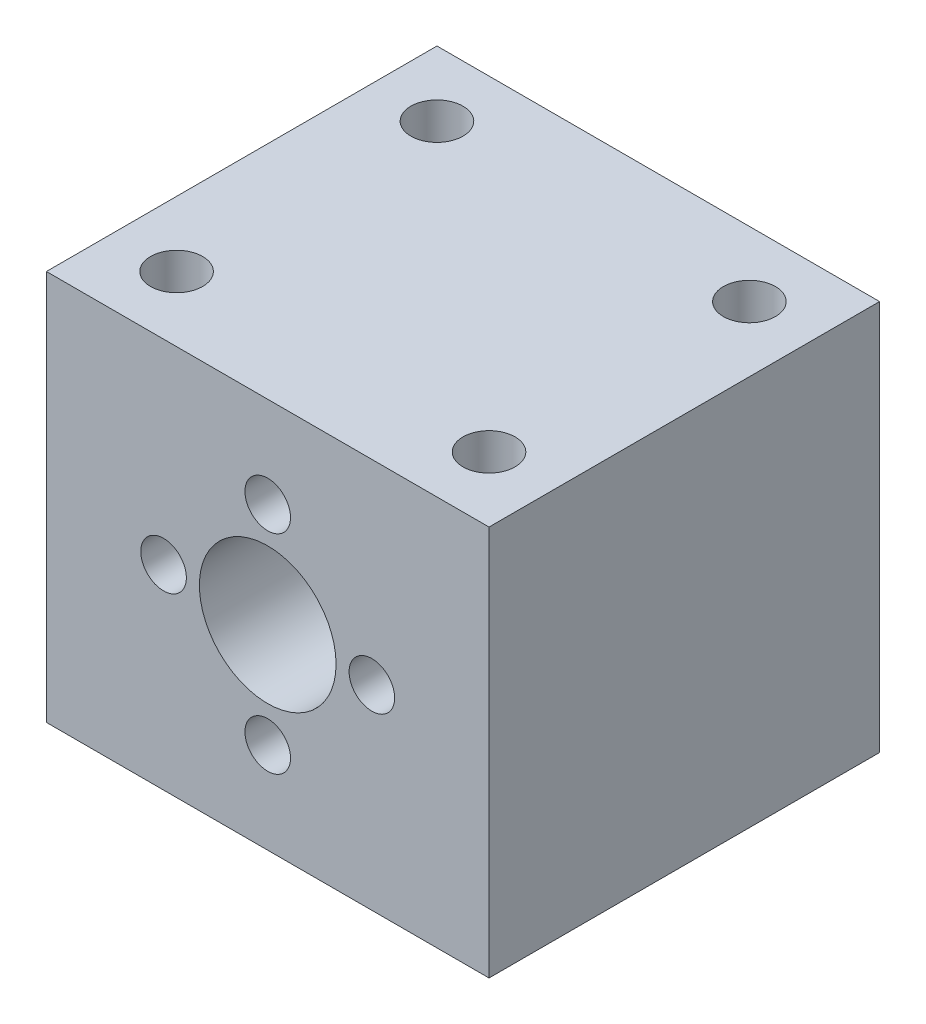
ISO-10303-21;
HEADER;
FILE_DESCRIPTION(('STEP AP214'),'2;1');
FILE_NAME('part.step','',(''),(''),'','','');
FILE_SCHEMA(('AUTOMOTIVE_DESIGN { 1 0 10303 214 1 1 1 1 }'));
ENDSEC;
DATA;
#1=APPLICATION_CONTEXT('core data for automotive mechanical design processes');
#2=APPLICATION_PROTOCOL_DEFINITION('international standard','automotive_design',2000,#1);
#3=PRODUCT_CONTEXT('',#1,'mechanical');
#4=PRODUCT('Part','Part','',(#3));
#5=PRODUCT_RELATED_PRODUCT_CATEGORY('part','',(#4));
#6=PRODUCT_DEFINITION_FORMATION('','',#4);
#7=PRODUCT_DEFINITION_CONTEXT('part definition',#1,'design');
#8=PRODUCT_DEFINITION('design','',#6,#7);
#9=PRODUCT_DEFINITION_SHAPE('','',#8);
#10=(LENGTH_UNIT() NAMED_UNIT(*) SI_UNIT(.MILLI.,.METRE.));
#11=(NAMED_UNIT(*) PLANE_ANGLE_UNIT() SI_UNIT($,.RADIAN.));
#12=(NAMED_UNIT(*) SI_UNIT($,.STERADIAN.) SOLID_ANGLE_UNIT());
#13=UNCERTAINTY_MEASURE_WITH_UNIT(LENGTH_MEASURE(1.E-05),#10,'distance_accuracy_value','');
#14=(GEOMETRIC_REPRESENTATION_CONTEXT(3) GLOBAL_UNCERTAINTY_ASSIGNED_CONTEXT((#13)) GLOBAL_UNIT_ASSIGNED_CONTEXT((#10,
#11,#12)) REPRESENTATION_CONTEXT('',''));
#15=CARTESIAN_POINT('',(0.,0.,0.));
#16=DIRECTION('',(0.,0.,1.));
#17=DIRECTION('',(1.,0.,0.));
#18=AXIS2_PLACEMENT_3D('',#15,#16,#17);
#19=CARTESIAN_POINT('',(0.,0.,30.));
#20=DIRECTION('',(0.,0.,-1.));
#21=DIRECTION('',(-1.,0.,0.));
#22=AXIS2_PLACEMENT_3D('',#19,#20,#21);
#23=PLANE('',#22);
#24=CARTESIAN_POINT('',(-8.,0.,30.));
#25=DIRECTION('',(0.,0.,1.));
#26=DIRECTION('',(1.,0.,0.));
#27=AXIS2_PLACEMENT_3D('',#24,#25,#26);
#28=CIRCLE('',#27,1.75);
#29=CARTESIAN_POINT('',(-6.25,0.,30.));
#30=VERTEX_POINT('',#29);
#31=EDGE_CURVE('E142',#30,#30,#28,.T.);
#32=ORIENTED_EDGE('',*,*,#31,.F.);
#33=EDGE_LOOP('',(#32));
#34=FACE_BOUND('',#33,.T.);
#35=CARTESIAN_POINT('',(0.,8.,30.));
#36=DIRECTION('',(0.,0.,1.));
#37=DIRECTION('',(1.,0.,0.));
#38=AXIS2_PLACEMENT_3D('',#35,#36,#37);
#39=CIRCLE('',#38,1.75);
#40=CARTESIAN_POINT('',(1.75000000000003,8.,30.));
#41=VERTEX_POINT('',#40);
#42=EDGE_CURVE('E136',#41,#41,#39,.T.);
#43=ORIENTED_EDGE('',*,*,#42,.F.);
#44=EDGE_LOOP('',(#43));
#45=FACE_BOUND('',#44,.T.);
#46=CARTESIAN_POINT('',(8.,0.,30.));
#47=DIRECTION('',(0.,0.,1.));
#48=DIRECTION('',(1.,0.,0.));
#49=AXIS2_PLACEMENT_3D('',#46,#47,#48);
#50=CIRCLE('',#49,1.75);
#51=CARTESIAN_POINT('',(9.75,0.,30.));
#52=VERTEX_POINT('',#51);
#53=EDGE_CURVE('E130',#52,#52,#50,.T.);
#54=ORIENTED_EDGE('',*,*,#53,.F.);
#55=EDGE_LOOP('',(#54));
#56=FACE_BOUND('',#55,.T.);
#57=CARTESIAN_POINT('',(0.,-8.,30.));
#58=DIRECTION('',(0.,0.,1.));
#59=DIRECTION('',(1.,0.,0.));
#60=AXIS2_PLACEMENT_3D('',#57,#58,#59);
#61=CIRCLE('',#60,1.75);
#62=CARTESIAN_POINT('',(1.74999999999992,-8.,30.));
#63=VERTEX_POINT('',#62);
#64=EDGE_CURVE('E123',#63,#63,#61,.T.);
#65=ORIENTED_EDGE('',*,*,#64,.F.);
#66=EDGE_LOOP('',(#65));
#67=FACE_BOUND('',#66,.T.);
#68=DIRECTION('',(0.,-1.,0.));
#69=VECTOR('',#68,1.);
#70=CARTESIAN_POINT('',(-17.,15.,30.));
#71=LINE('',#70,#69);
#72=CARTESIAN_POINT('',(-17.,15.,30.));
#73=VERTEX_POINT('',#72);
#74=CARTESIAN_POINT('',(-17.,-15.,30.));
#75=VERTEX_POINT('',#74);
#76=EDGE_CURVE('E90',#73,#75,#71,.T.);
#77=ORIENTED_EDGE('',*,*,#76,.T.);
#78=DIRECTION('',(1.,0.,0.));
#79=VECTOR('',#78,1.);
#80=CARTESIAN_POINT('',(17.,-15.,30.));
#81=LINE('',#80,#79);
#82=CARTESIAN_POINT('',(17.,-15.,30.));
#83=VERTEX_POINT('',#82);
#84=EDGE_CURVE('E85',#75,#83,#81,.T.);
#85=ORIENTED_EDGE('',*,*,#84,.T.);
#86=DIRECTION('',(0.,1.,0.));
#87=VECTOR('',#86,1.);
#88=CARTESIAN_POINT('',(17.,15.,30.));
#89=LINE('',#88,#87);
#90=CARTESIAN_POINT('',(17.,15.,30.));
#91=VERTEX_POINT('',#90);
#92=EDGE_CURVE('E88',#83,#91,#89,.T.);
#93=ORIENTED_EDGE('',*,*,#92,.T.);
#94=DIRECTION('',(-1.,0.,0.));
#95=VECTOR('',#94,1.);
#96=CARTESIAN_POINT('',(17.,15.,30.));
#97=LINE('',#96,#95);
#98=EDGE_CURVE('E55',#91,#73,#97,.T.);
#99=ORIENTED_EDGE('',*,*,#98,.T.);
#100=EDGE_LOOP('',(#77,#85,#93,#99));
#101=FACE_BOUND('',#100,.T.);
#102=CARTESIAN_POINT('',(0.,0.,30.));
#103=DIRECTION('',(0.,0.,1.));
#104=DIRECTION('',(1.,0.,0.));
#105=AXIS2_PLACEMENT_3D('',#102,#103,#104);
#106=CIRCLE('',#105,5.25);
#107=CARTESIAN_POINT('',(5.25,0.,30.));
#108=VERTEX_POINT('',#107);
#109=EDGE_CURVE('E105',#108,#108,#106,.T.);
#110=ORIENTED_EDGE('',*,*,#109,.F.);
#111=EDGE_LOOP('',(#110));
#112=FACE_BOUND('',#111,.T.);
#113=ADVANCED_FACE('F38',(#34,#45,#56,#67,#101,#112),#23,.F.);
#114=CARTESIAN_POINT('',(0.,0.,0.));
#115=DIRECTION('',(0.,0.,-1.));
#116=DIRECTION('',(-1.,0.,0.));
#117=AXIS2_PLACEMENT_3D('',#114,#115,#116);
#118=PLANE('',#117);
#119=DIRECTION('',(0.,-1.,0.));
#120=VECTOR('',#119,1.);
#121=CARTESIAN_POINT('',(-17.,15.,0.));
#122=LINE('',#121,#120);
#123=CARTESIAN_POINT('',(-17.,15.,0.));
#124=VERTEX_POINT('',#123);
#125=CARTESIAN_POINT('',(-17.,-15.,0.));
#126=VERTEX_POINT('',#125);
#127=EDGE_CURVE('E102',#124,#126,#122,.T.);
#128=ORIENTED_EDGE('',*,*,#127,.F.);
#129=DIRECTION('',(-1.,0.,0.));
#130=VECTOR('',#129,1.);
#131=CARTESIAN_POINT('',(17.,15.,0.));
#132=LINE('',#131,#130);
#133=CARTESIAN_POINT('',(17.,15.,0.));
#134=VERTEX_POINT('',#133);
#135=EDGE_CURVE('E78',#134,#124,#132,.T.);
#136=ORIENTED_EDGE('',*,*,#135,.F.);
#137=DIRECTION('',(0.,1.,0.));
#138=VECTOR('',#137,1.);
#139=CARTESIAN_POINT('',(17.,15.,0.));
#140=LINE('',#139,#138);
#141=CARTESIAN_POINT('',(17.,-15.,0.));
#142=VERTEX_POINT('',#141);
#143=EDGE_CURVE('E72',#142,#134,#140,.T.);
#144=ORIENTED_EDGE('',*,*,#143,.F.);
#145=DIRECTION('',(1.,0.,0.));
#146=VECTOR('',#145,1.);
#147=CARTESIAN_POINT('',(17.,-15.,0.));
#148=LINE('',#147,#146);
#149=EDGE_CURVE('E94',#126,#142,#148,.T.);
#150=ORIENTED_EDGE('',*,*,#149,.F.);
#151=EDGE_LOOP('',(#128,#136,#144,#150));
#152=FACE_BOUND('',#151,.T.);
#153=CARTESIAN_POINT('',(0.,0.,0.));
#154=DIRECTION('',(0.,0.,1.));
#155=DIRECTION('',(1.,0.,0.));
#156=AXIS2_PLACEMENT_3D('',#153,#154,#155);
#157=CIRCLE('',#156,5.25);
#158=CARTESIAN_POINT('',(5.25,0.,0.));
#159=VERTEX_POINT('',#158);
#160=EDGE_CURVE('E117',#159,#159,#157,.T.);
#161=ORIENTED_EDGE('',*,*,#160,.T.);
#162=EDGE_LOOP('',(#161));
#163=FACE_BOUND('',#162,.T.);
#164=ADVANCED_FACE('F113',(#152,#163),#118,.T.);
#165=CARTESIAN_POINT('',(-17.,15.,30.));
#166=DIRECTION('',(1.,0.,0.));
#167=DIRECTION('',(0.,1.,0.));
#168=AXIS2_PLACEMENT_3D('',#165,#166,#167);
#169=PLANE('',#168);
#170=ORIENTED_EDGE('',*,*,#127,.T.);
#171=DIRECTION('',(0.,0.,-1.));
#172=VECTOR('',#171,1.);
#173=CARTESIAN_POINT('',(-17.,-15.,30.));
#174=LINE('',#173,#172);
#175=EDGE_CURVE('E11',#75,#126,#174,.T.);
#176=ORIENTED_EDGE('',*,*,#175,.F.);
#177=ORIENTED_EDGE('',*,*,#76,.F.);
#178=DIRECTION('',(0.,0.,-1.));
#179=VECTOR('',#178,1.);
#180=CARTESIAN_POINT('',(-17.,15.,30.));
#181=LINE('',#180,#179);
#182=EDGE_CURVE('E98',#73,#124,#181,.T.);
#183=ORIENTED_EDGE('',*,*,#182,.T.);
#184=EDGE_LOOP('',(#170,#176,#177,#183));
#185=FACE_BOUND('',#184,.T.);
#186=ADVANCED_FACE('F40',(#185),#169,.F.);
#187=CARTESIAN_POINT('',(17.,-15.,30.));
#188=DIRECTION('',(0.,1.,0.));
#189=DIRECTION('',(-1.,0.,0.));
#190=AXIS2_PLACEMENT_3D('',#187,#188,#189);
#191=PLANE('',#190);
#192=ORIENTED_EDGE('',*,*,#149,.T.);
#193=DIRECTION('',(0.,0.,-1.));
#194=VECTOR('',#193,1.);
#195=CARTESIAN_POINT('',(17.,-15.,30.));
#196=LINE('',#195,#194);
#197=EDGE_CURVE('E47',#83,#142,#196,.T.);
#198=ORIENTED_EDGE('',*,*,#197,.F.);
#199=ORIENTED_EDGE('',*,*,#84,.F.);
#200=ORIENTED_EDGE('',*,*,#175,.T.);
#201=EDGE_LOOP('',(#192,#198,#199,#200));
#202=FACE_BOUND('',#201,.T.);
#203=ADVANCED_FACE('F93',(#202),#191,.F.);
#204=CARTESIAN_POINT('',(17.,15.,30.));
#205=DIRECTION('',(-1.,0.,0.));
#206=DIRECTION('',(0.,-1.,0.));
#207=AXIS2_PLACEMENT_3D('',#204,#205,#206);
#208=PLANE('',#207);
#209=ORIENTED_EDGE('',*,*,#143,.T.);
#210=DIRECTION('',(0.,0.,-1.));
#211=VECTOR('',#210,1.);
#212=CARTESIAN_POINT('',(17.,15.,30.));
#213=LINE('',#212,#211);
#214=EDGE_CURVE('E95',#91,#134,#213,.T.);
#215=ORIENTED_EDGE('',*,*,#214,.F.);
#216=ORIENTED_EDGE('',*,*,#92,.F.);
#217=ORIENTED_EDGE('',*,*,#197,.T.);
#218=EDGE_LOOP('',(#209,#215,#216,#217));
#219=FACE_BOUND('',#218,.T.);
#220=ADVANCED_FACE('F96',(#219),#208,.F.);
#221=CARTESIAN_POINT('',(17.,15.,30.));
#222=DIRECTION('',(0.,-1.,0.));
#223=DIRECTION('',(1.,0.,0.));
#224=AXIS2_PLACEMENT_3D('',#221,#222,#223);
#225=PLANE('',#224);
#226=CARTESIAN_POINT('',(12.,15.,5.));
#227=DIRECTION('',(0.,1.,0.));
#228=DIRECTION('',(-1.,0.,0.));
#229=AXIS2_PLACEMENT_3D('',#226,#227,#228);
#230=CIRCLE('',#229,2.);
#231=CARTESIAN_POINT('',(9.99999999999999,15.,5.));
#232=VERTEX_POINT('',#231);
#233=EDGE_CURVE('E153',#232,#232,#230,.T.);
#234=ORIENTED_EDGE('',*,*,#233,.F.);
#235=EDGE_LOOP('',(#234));
#236=FACE_BOUND('',#235,.T.);
#237=CARTESIAN_POINT('',(-12.,15.,5.));
#238=DIRECTION('',(0.,1.,0.));
#239=DIRECTION('',(-1.,0.,0.));
#240=AXIS2_PLACEMENT_3D('',#237,#238,#239);
#241=CIRCLE('',#240,2.);
#242=CARTESIAN_POINT('',(-14.,15.,5.));
#243=VERTEX_POINT('',#242);
#244=EDGE_CURVE('E159',#243,#243,#241,.T.);
#245=ORIENTED_EDGE('',*,*,#244,.F.);
#246=EDGE_LOOP('',(#245));
#247=FACE_BOUND('',#246,.T.);
#248=CARTESIAN_POINT('',(-12.,15.,25.));
#249=DIRECTION('',(0.,1.,0.));
#250=DIRECTION('',(-1.,0.,0.));
#251=AXIS2_PLACEMENT_3D('',#248,#249,#250);
#252=CIRCLE('',#251,2.);
#253=CARTESIAN_POINT('',(-14.,15.,25.));
#254=VERTEX_POINT('',#253);
#255=EDGE_CURVE('E165',#254,#254,#252,.T.);
#256=ORIENTED_EDGE('',*,*,#255,.F.);
#257=EDGE_LOOP('',(#256));
#258=FACE_BOUND('',#257,.T.);
#259=CARTESIAN_POINT('',(12.,15.,25.));
#260=DIRECTION('',(0.,1.,0.));
#261=DIRECTION('',(-1.,0.,0.));
#262=AXIS2_PLACEMENT_3D('',#259,#260,#261);
#263=CIRCLE('',#262,2.);
#264=CARTESIAN_POINT('',(9.99999999999999,15.,25.));
#265=VERTEX_POINT('',#264);
#266=EDGE_CURVE('E147',#265,#265,#263,.T.);
#267=ORIENTED_EDGE('',*,*,#266,.F.);
#268=EDGE_LOOP('',(#267));
#269=FACE_BOUND('',#268,.T.);
#270=ORIENTED_EDGE('',*,*,#135,.T.);
#271=ORIENTED_EDGE('',*,*,#182,.F.);
#272=ORIENTED_EDGE('',*,*,#98,.F.);
#273=ORIENTED_EDGE('',*,*,#214,.T.);
#274=EDGE_LOOP('',(#270,#271,#272,#273));
#275=FACE_BOUND('',#274,.T.);
#276=ADVANCED_FACE('F110',(#236,#247,#258,#269,#275),#225,.F.);
#277=CARTESIAN_POINT('',(0.,0.,30.));
#278=DIRECTION('',(0.,0.,-1.));
#279=DIRECTION('',(-1.,0.,0.));
#280=AXIS2_PLACEMENT_3D('',#277,#278,#279);
#281=CYLINDRICAL_SURFACE('',#280,5.25);
#282=ORIENTED_EDGE('',*,*,#109,.T.);
#283=EDGE_LOOP('',(#282));
#284=FACE_BOUND('',#283,.T.);
#285=ORIENTED_EDGE('',*,*,#160,.F.);
#286=EDGE_LOOP('',(#285));
#287=FACE_BOUND('',#286,.T.);
#288=ADVANCED_FACE('F182',(#284,#287),#281,.F.);
#289=CARTESIAN_POINT('',(0.,-8.,20.));
#290=DIRECTION('',(0.,0.,1.));
#291=DIRECTION('',(1.,0.,0.));
#292=AXIS2_PLACEMENT_3D('',#289,#290,#291);
#293=CYLINDRICAL_SURFACE('',#292,1.75);
#294=CARTESIAN_POINT('',(0.,-8.,20.));
#295=DIRECTION('',(0.,0.,1.));
#296=DIRECTION('',(1.,0.,0.));
#297=AXIS2_PLACEMENT_3D('',#294,#295,#296);
#298=CIRCLE('',#297,1.75);
#299=CARTESIAN_POINT('',(1.74999999999992,-8.,20.));
#300=VERTEX_POINT('',#299);
#301=EDGE_CURVE('E126',#300,#300,#298,.T.);
#302=ORIENTED_EDGE('',*,*,#301,.F.);
#303=EDGE_LOOP('',(#302));
#304=FACE_BOUND('',#303,.T.);
#305=ORIENTED_EDGE('',*,*,#64,.T.);
#306=EDGE_LOOP('',(#305));
#307=FACE_BOUND('',#306,.T.);
#308=ADVANCED_FACE('F255',(#304,#307),#293,.F.);
#309=CARTESIAN_POINT('',(0.,-8.,20.));
#310=DIRECTION('',(0.,0.,1.));
#311=DIRECTION('',(1.,0.,0.));
#312=AXIS2_PLACEMENT_3D('',#309,#310,#311);
#313=PLANE('',#312);
#314=ORIENTED_EDGE('',*,*,#301,.T.);
#315=EDGE_LOOP('',(#314));
#316=FACE_BOUND('',#315,.T.);
#317=ADVANCED_FACE('F263',(#316),#313,.T.);
#318=CARTESIAN_POINT('',(8.,0.,20.));
#319=DIRECTION('',(0.,0.,1.));
#320=DIRECTION('',(1.,0.,0.));
#321=AXIS2_PLACEMENT_3D('',#318,#319,#320);
#322=CYLINDRICAL_SURFACE('',#321,1.75);
#323=CARTESIAN_POINT('',(8.,0.,20.));
#324=DIRECTION('',(0.,0.,1.));
#325=DIRECTION('',(1.,0.,0.));
#326=AXIS2_PLACEMENT_3D('',#323,#324,#325);
#327=CIRCLE('',#326,1.75);
#328=CARTESIAN_POINT('',(9.75,0.,20.));
#329=VERTEX_POINT('',#328);
#330=EDGE_CURVE('E133',#329,#329,#327,.T.);
#331=ORIENTED_EDGE('',*,*,#330,.F.);
#332=EDGE_LOOP('',(#331));
#333=FACE_BOUND('',#332,.T.);
#334=ORIENTED_EDGE('',*,*,#53,.T.);
#335=EDGE_LOOP('',(#334));
#336=FACE_BOUND('',#335,.T.);
#337=ADVANCED_FACE('F271',(#333,#336),#322,.F.);
#338=CARTESIAN_POINT('',(8.,0.,20.));
#339=DIRECTION('',(0.,0.,1.));
#340=DIRECTION('',(1.,0.,0.));
#341=AXIS2_PLACEMENT_3D('',#338,#339,#340);
#342=PLANE('',#341);
#343=ORIENTED_EDGE('',*,*,#330,.T.);
#344=EDGE_LOOP('',(#343));
#345=FACE_BOUND('',#344,.T.);
#346=ADVANCED_FACE('F280',(#345),#342,.T.);
#347=CARTESIAN_POINT('',(0.,8.,20.));
#348=DIRECTION('',(0.,0.,1.));
#349=DIRECTION('',(1.,0.,0.));
#350=AXIS2_PLACEMENT_3D('',#347,#348,#349);
#351=CYLINDRICAL_SURFACE('',#350,1.75);
#352=CARTESIAN_POINT('',(0.,8.,20.));
#353=DIRECTION('',(0.,0.,1.));
#354=DIRECTION('',(1.,0.,0.));
#355=AXIS2_PLACEMENT_3D('',#352,#353,#354);
#356=CIRCLE('',#355,1.75);
#357=CARTESIAN_POINT('',(1.75000000000003,8.,20.));
#358=VERTEX_POINT('',#357);
#359=EDGE_CURVE('E139',#358,#358,#356,.T.);
#360=ORIENTED_EDGE('',*,*,#359,.F.);
#361=EDGE_LOOP('',(#360));
#362=FACE_BOUND('',#361,.T.);
#363=ORIENTED_EDGE('',*,*,#42,.T.);
#364=EDGE_LOOP('',(#363));
#365=FACE_BOUND('',#364,.T.);
#366=ADVANCED_FACE('F289',(#362,#365),#351,.F.);
#367=CARTESIAN_POINT('',(0.,8.,20.));
#368=DIRECTION('',(0.,0.,1.));
#369=DIRECTION('',(1.,0.,0.));
#370=AXIS2_PLACEMENT_3D('',#367,#368,#369);
#371=PLANE('',#370);
#372=ORIENTED_EDGE('',*,*,#359,.T.);
#373=EDGE_LOOP('',(#372));
#374=FACE_BOUND('',#373,.T.);
#375=ADVANCED_FACE('F298',(#374),#371,.T.);
#376=CARTESIAN_POINT('',(-8.,0.,20.));
#377=DIRECTION('',(0.,0.,1.));
#378=DIRECTION('',(1.,0.,0.));
#379=AXIS2_PLACEMENT_3D('',#376,#377,#378);
#380=CYLINDRICAL_SURFACE('',#379,1.75);
#381=CARTESIAN_POINT('',(-8.,0.,20.));
#382=DIRECTION('',(0.,0.,1.));
#383=DIRECTION('',(1.,0.,0.));
#384=AXIS2_PLACEMENT_3D('',#381,#382,#383);
#385=CIRCLE('',#384,1.75);
#386=CARTESIAN_POINT('',(-6.25,0.,20.));
#387=VERTEX_POINT('',#386);
#388=EDGE_CURVE('E120',#387,#387,#385,.T.);
#389=ORIENTED_EDGE('',*,*,#388,.F.);
#390=EDGE_LOOP('',(#389));
#391=FACE_BOUND('',#390,.T.);
#392=ORIENTED_EDGE('',*,*,#31,.T.);
#393=EDGE_LOOP('',(#392));
#394=FACE_BOUND('',#393,.T.);
#395=ADVANCED_FACE('F198',(#391,#394),#380,.F.);
#396=CARTESIAN_POINT('',(-8.,0.,20.));
#397=DIRECTION('',(0.,0.,1.));
#398=DIRECTION('',(1.,0.,0.));
#399=AXIS2_PLACEMENT_3D('',#396,#397,#398);
#400=PLANE('',#399);
#401=ORIENTED_EDGE('',*,*,#388,.T.);
#402=EDGE_LOOP('',(#401));
#403=FACE_BOUND('',#402,.T.);
#404=ADVANCED_FACE('F189',(#403),#400,.T.);
#405=CARTESIAN_POINT('',(12.,5.,25.));
#406=DIRECTION('',(0.,1.,0.));
#407=DIRECTION('',(-1.,0.,0.));
#408=AXIS2_PLACEMENT_3D('',#405,#406,#407);
#409=CYLINDRICAL_SURFACE('',#408,2.);
#410=CARTESIAN_POINT('',(12.,5.,25.));
#411=DIRECTION('',(0.,1.,0.));
#412=DIRECTION('',(-1.,0.,0.));
#413=AXIS2_PLACEMENT_3D('',#410,#411,#412);
#414=CIRCLE('',#413,2.);
#415=CARTESIAN_POINT('',(9.99999999999999,5.,25.));
#416=VERTEX_POINT('',#415);
#417=EDGE_CURVE('E127',#416,#416,#414,.T.);
#418=ORIENTED_EDGE('',*,*,#417,.F.);
#419=EDGE_LOOP('',(#418));
#420=FACE_BOUND('',#419,.T.);
#421=ORIENTED_EDGE('',*,*,#266,.T.);
#422=EDGE_LOOP('',(#421));
#423=FACE_BOUND('',#422,.T.);
#424=ADVANCED_FACE('F187',(#420,#423),#409,.F.);
#425=CARTESIAN_POINT('',(12.,5.,25.));
#426=DIRECTION('',(0.,1.,0.));
#427=DIRECTION('',(-1.,0.,0.));
#428=AXIS2_PLACEMENT_3D('',#425,#426,#427);
#429=PLANE('',#428);
#430=ORIENTED_EDGE('',*,*,#417,.T.);
#431=EDGE_LOOP('',(#430));
#432=FACE_BOUND('',#431,.T.);
#433=ADVANCED_FACE('F176',(#432),#429,.T.);
#434=CARTESIAN_POINT('',(-12.,5.,25.));
#435=DIRECTION('',(0.,1.,0.));
#436=DIRECTION('',(-1.,0.,0.));
#437=AXIS2_PLACEMENT_3D('',#434,#435,#436);
#438=CYLINDRICAL_SURFACE('',#437,2.);
#439=CARTESIAN_POINT('',(-12.,5.,25.));
#440=DIRECTION('',(0.,1.,0.));
#441=DIRECTION('',(-1.,0.,0.));
#442=AXIS2_PLACEMENT_3D('',#439,#440,#441);
#443=CIRCLE('',#442,2.);
#444=CARTESIAN_POINT('',(-14.,5.,25.));
#445=VERTEX_POINT('',#444);
#446=EDGE_CURVE('E150',#445,#445,#443,.T.);
#447=ORIENTED_EDGE('',*,*,#446,.F.);
#448=EDGE_LOOP('',(#447));
#449=FACE_BOUND('',#448,.T.);
#450=ORIENTED_EDGE('',*,*,#255,.T.);
#451=EDGE_LOOP('',(#450));
#452=FACE_BOUND('',#451,.T.);
#453=ADVANCED_FACE('F173',(#449,#452),#438,.F.);
#454=CARTESIAN_POINT('',(-12.,5.,25.));
#455=DIRECTION('',(0.,1.,0.));
#456=DIRECTION('',(-1.,0.,0.));
#457=AXIS2_PLACEMENT_3D('',#454,#455,#456);
#458=PLANE('',#457);
#459=ORIENTED_EDGE('',*,*,#446,.T.);
#460=EDGE_LOOP('',(#459));
#461=FACE_BOUND('',#460,.T.);
#462=ADVANCED_FACE('F171',(#461),#458,.T.);
#463=CARTESIAN_POINT('',(-12.,5.,5.));
#464=DIRECTION('',(0.,1.,0.));
#465=DIRECTION('',(-1.,0.,0.));
#466=AXIS2_PLACEMENT_3D('',#463,#464,#465);
#467=CYLINDRICAL_SURFACE('',#466,2.);
#468=CARTESIAN_POINT('',(-12.,5.,5.));
#469=DIRECTION('',(0.,1.,0.));
#470=DIRECTION('',(-1.,0.,0.));
#471=AXIS2_PLACEMENT_3D('',#468,#469,#470);
#472=CIRCLE('',#471,2.);
#473=CARTESIAN_POINT('',(-14.,5.,5.));
#474=VERTEX_POINT('',#473);
#475=EDGE_CURVE('E162',#474,#474,#472,.T.);
#476=ORIENTED_EDGE('',*,*,#475,.F.);
#477=EDGE_LOOP('',(#476));
#478=FACE_BOUND('',#477,.T.);
#479=ORIENTED_EDGE('',*,*,#244,.T.);
#480=EDGE_LOOP('',(#479));
#481=FACE_BOUND('',#480,.T.);
#482=ADVANCED_FACE('F341',(#478,#481),#467,.F.);
#483=CARTESIAN_POINT('',(-12.,5.,5.));
#484=DIRECTION('',(0.,1.,0.));
#485=DIRECTION('',(-1.,0.,0.));
#486=AXIS2_PLACEMENT_3D('',#483,#484,#485);
#487=PLANE('',#486);
#488=ORIENTED_EDGE('',*,*,#475,.T.);
#489=EDGE_LOOP('',(#488));
#490=FACE_BOUND('',#489,.T.);
#491=ADVANCED_FACE('F349',(#490),#487,.T.);
#492=CARTESIAN_POINT('',(12.,5.,5.));
#493=DIRECTION('',(0.,1.,0.));
#494=DIRECTION('',(-1.,0.,0.));
#495=AXIS2_PLACEMENT_3D('',#492,#493,#494);
#496=CYLINDRICAL_SURFACE('',#495,2.);
#497=CARTESIAN_POINT('',(12.,5.,5.));
#498=DIRECTION('',(0.,1.,0.));
#499=DIRECTION('',(-1.,0.,0.));
#500=AXIS2_PLACEMENT_3D('',#497,#498,#499);
#501=CIRCLE('',#500,2.);
#502=CARTESIAN_POINT('',(9.99999999999999,5.,5.));
#503=VERTEX_POINT('',#502);
#504=EDGE_CURVE('E156',#503,#503,#501,.T.);
#505=ORIENTED_EDGE('',*,*,#504,.F.);
#506=EDGE_LOOP('',(#505));
#507=FACE_BOUND('',#506,.T.);
#508=ORIENTED_EDGE('',*,*,#233,.T.);
#509=EDGE_LOOP('',(#508));
#510=FACE_BOUND('',#509,.T.);
#511=ADVANCED_FACE('F358',(#507,#510),#496,.F.);
#512=CARTESIAN_POINT('',(12.,5.,5.));
#513=DIRECTION('',(0.,1.,0.));
#514=DIRECTION('',(-1.,0.,0.));
#515=AXIS2_PLACEMENT_3D('',#512,#513,#514);
#516=PLANE('',#515);
#517=ORIENTED_EDGE('',*,*,#504,.T.);
#518=EDGE_LOOP('',(#517));
#519=FACE_BOUND('',#518,.T.);
#520=ADVANCED_FACE('F367',(#519),#516,.T.);
#521=CLOSED_SHELL('',(#113,#164,#186,#203,#220,#276,#288,#308,#317,#337,#346,#366,#375,#395,
#404,#424,#433,#453,#462,#482,#491,#511,#520));
#522=MANIFOLD_SOLID_BREP('B2',#521);
#523=ADVANCED_BREP_SHAPE_REPRESENTATION('',(#18,#522),#14);
#524=SHAPE_DEFINITION_REPRESENTATION(#9,#523);
ENDSEC;
END-ISO-10303-21;
